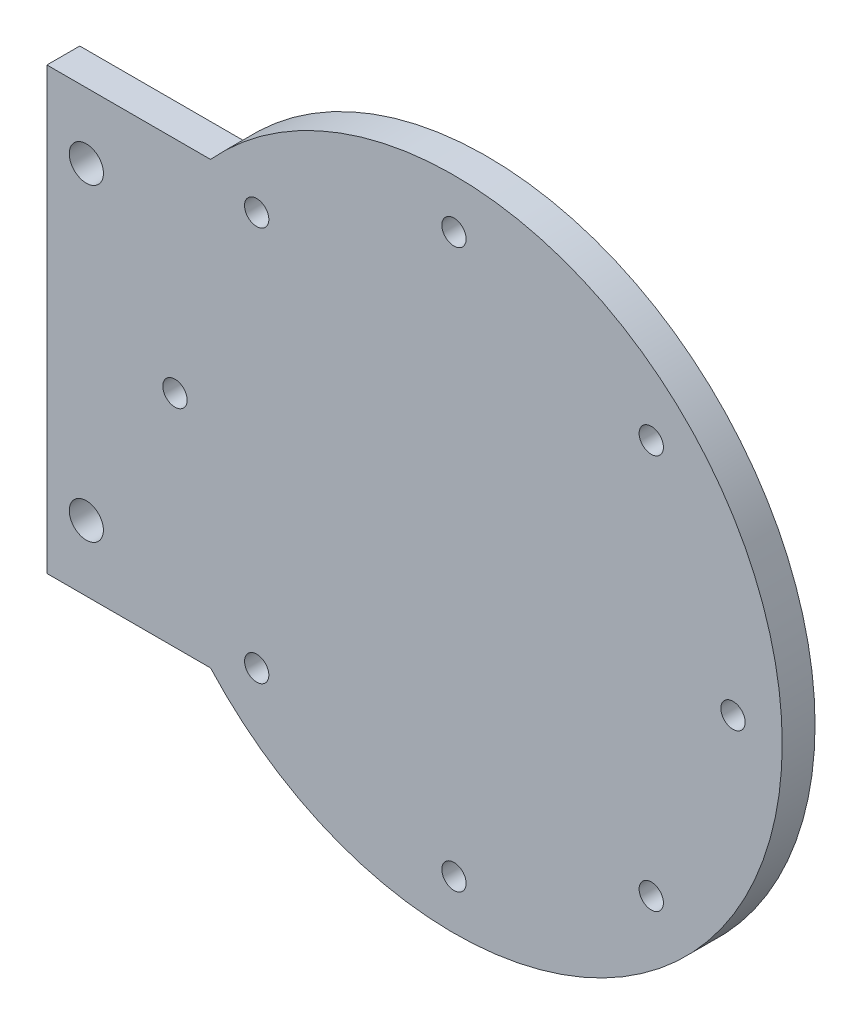
ISO-10303-21;
HEADER;
FILE_DESCRIPTION(('STEP AP214'),'2;1');
FILE_NAME('part.step','',(''),(''),'','','');
FILE_SCHEMA(('AUTOMOTIVE_DESIGN { 1 0 10303 214 1 1 1 1 }'));
ENDSEC;
DATA;
#1=APPLICATION_CONTEXT('core data for automotive mechanical design processes');
#2=APPLICATION_PROTOCOL_DEFINITION('international standard','automotive_design',2000,#1);
#3=PRODUCT_CONTEXT('',#1,'mechanical');
#4=PRODUCT('Part','Part','',(#3));
#5=PRODUCT_RELATED_PRODUCT_CATEGORY('part','',(#4));
#6=PRODUCT_DEFINITION_FORMATION('','',#4);
#7=PRODUCT_DEFINITION_CONTEXT('part definition',#1,'design');
#8=PRODUCT_DEFINITION('design','',#6,#7);
#9=PRODUCT_DEFINITION_SHAPE('','',#8);
#10=(LENGTH_UNIT() NAMED_UNIT(*) SI_UNIT(.MILLI.,.METRE.));
#11=(NAMED_UNIT(*) PLANE_ANGLE_UNIT() SI_UNIT($,.RADIAN.));
#12=(NAMED_UNIT(*) SI_UNIT($,.STERADIAN.) SOLID_ANGLE_UNIT());
#13=UNCERTAINTY_MEASURE_WITH_UNIT(LENGTH_MEASURE(1.E-05),#10,'distance_accuracy_value','');
#14=(GEOMETRIC_REPRESENTATION_CONTEXT(3) GLOBAL_UNCERTAINTY_ASSIGNED_CONTEXT((#13)) GLOBAL_UNIT_ASSIGNED_CONTEXT((#10,
#11,#12)) REPRESENTATION_CONTEXT('',''));
#15=CARTESIAN_POINT('',(0.,0.,0.));
#16=DIRECTION('',(0.,0.,1.));
#17=DIRECTION('',(1.,0.,0.));
#18=AXIS2_PLACEMENT_3D('',#15,#16,#17);
#19=CARTESIAN_POINT('',(0.,0.,5.));
#20=DIRECTION('',(0.,0.,1.));
#21=DIRECTION('',(1.,0.,0.));
#22=AXIS2_PLACEMENT_3D('',#19,#20,#21);
#23=PLANE('',#22);
#24=CARTESIAN_POINT('',(-36.3216750602466,-0.267487409630021,5.));
#25=DIRECTION('',(0.,0.,1.));
#26=DIRECTION('',(1.,0.,0.));
#27=AXIS2_PLACEMENT_3D('',#24,#25,#26);
#28=CIRCLE('',#27,1.85);
#29=CARTESIAN_POINT('',(-34.4716750602466,-0.267487409630021,5.));
#30=VERTEX_POINT('',#29);
#31=EDGE_CURVE('E143',#30,#30,#28,.T.);
#32=ORIENTED_EDGE('',*,*,#31,.F.);
#33=EDGE_LOOP('',(#32));
#34=FACE_BOUND('',#33,.T.);
#35=CARTESIAN_POINT('',(-23.8737132606749,-30.3195256100583,5.));
#36=DIRECTION('',(0.,0.,1.));
#37=DIRECTION('',(1.,0.,0.));
#38=AXIS2_PLACEMENT_3D('',#35,#36,#37);
#39=CIRCLE('',#38,1.85);
#40=CARTESIAN_POINT('',(-22.0237132606749,-30.3195256100583,5.));
#41=VERTEX_POINT('',#40);
#42=EDGE_CURVE('E148',#41,#41,#39,.T.);
#43=ORIENTED_EDGE('',*,*,#42,.F.);
#44=EDGE_LOOP('',(#43));
#45=FACE_BOUND('',#44,.T.);
#46=CARTESIAN_POINT('',(6.17832493975338,-42.76748740963,5.));
#47=DIRECTION('',(0.,0.,1.));
#48=DIRECTION('',(1.,0.,0.));
#49=AXIS2_PLACEMENT_3D('',#46,#47,#48);
#50=CIRCLE('',#49,1.85);
#51=CARTESIAN_POINT('',(8.02832493975338,-42.76748740963,5.));
#52=VERTEX_POINT('',#51);
#53=EDGE_CURVE('E151',#52,#52,#50,.T.);
#54=ORIENTED_EDGE('',*,*,#53,.F.);
#55=EDGE_LOOP('',(#54));
#56=FACE_BOUND('',#55,.T.);
#57=CARTESIAN_POINT('',(36.2303631401817,-30.3195256100583,5.));
#58=DIRECTION('',(0.,0.,1.));
#59=DIRECTION('',(1.,0.,0.));
#60=AXIS2_PLACEMENT_3D('',#57,#58,#59);
#61=CIRCLE('',#60,1.85);
#62=CARTESIAN_POINT('',(38.0803631401817,-30.3195256100583,5.));
#63=VERTEX_POINT('',#62);
#64=EDGE_CURVE('E154',#63,#63,#61,.T.);
#65=ORIENTED_EDGE('',*,*,#64,.F.);
#66=EDGE_LOOP('',(#65));
#67=FACE_BOUND('',#66,.T.);
#68=CARTESIAN_POINT('',(48.6783249397534,-0.267487409630026,5.));
#69=DIRECTION('',(0.,0.,1.));
#70=DIRECTION('',(1.,0.,0.));
#71=AXIS2_PLACEMENT_3D('',#68,#69,#70);
#72=CIRCLE('',#71,1.85);
#73=CARTESIAN_POINT('',(50.5283249397534,-0.267487409630026,5.));
#74=VERTEX_POINT('',#73);
#75=EDGE_CURVE('E157',#74,#74,#72,.T.);
#76=ORIENTED_EDGE('',*,*,#75,.F.);
#77=EDGE_LOOP('',(#76));
#78=FACE_BOUND('',#77,.T.);
#79=CARTESIAN_POINT('',(36.2303631401817,29.7845507907982,5.));
#80=DIRECTION('',(0.,0.,1.));
#81=DIRECTION('',(1.,0.,0.));
#82=AXIS2_PLACEMENT_3D('',#79,#80,#81);
#83=CIRCLE('',#82,1.85);
#84=CARTESIAN_POINT('',(38.0803631401817,29.7845507907982,5.));
#85=VERTEX_POINT('',#84);
#86=EDGE_CURVE('E160',#85,#85,#83,.T.);
#87=ORIENTED_EDGE('',*,*,#86,.F.);
#88=EDGE_LOOP('',(#87));
#89=FACE_BOUND('',#88,.T.);
#90=CARTESIAN_POINT('',(6.17832493975339,42.23251259037,5.));
#91=DIRECTION('',(0.,0.,1.));
#92=DIRECTION('',(1.,0.,0.));
#93=AXIS2_PLACEMENT_3D('',#90,#91,#92);
#94=CIRCLE('',#93,1.85);
#95=CARTESIAN_POINT('',(8.02832493975339,42.23251259037,5.));
#96=VERTEX_POINT('',#95);
#97=EDGE_CURVE('E163',#96,#96,#94,.T.);
#98=ORIENTED_EDGE('',*,*,#97,.F.);
#99=EDGE_LOOP('',(#98));
#100=FACE_BOUND('',#99,.T.);
#101=CARTESIAN_POINT('',(-23.8737132606749,29.7845507907983,5.));
#102=DIRECTION('',(0.,0.,1.));
#103=DIRECTION('',(1.,0.,0.));
#104=AXIS2_PLACEMENT_3D('',#101,#102,#103);
#105=CIRCLE('',#104,1.85);
#106=CARTESIAN_POINT('',(-22.0237132606749,29.7845507907983,5.));
#107=VERTEX_POINT('',#106);
#108=EDGE_CURVE('E166',#107,#107,#105,.T.);
#109=ORIENTED_EDGE('',*,*,#108,.F.);
#110=EDGE_LOOP('',(#109));
#111=FACE_BOUND('',#110,.T.);
#112=CARTESIAN_POINT('',(-49.8216750602466,-23.8085070721269,5.));
#113=DIRECTION('',(0.,0.,1.));
#114=DIRECTION('',(1.,0.,0.));
#115=AXIS2_PLACEMENT_3D('',#112,#113,#114);
#116=CIRCLE('',#115,2.6);
#117=CARTESIAN_POINT('',(-47.2216750602466,-23.8085070721269,5.));
#118=VERTEX_POINT('',#117);
#119=EDGE_CURVE('E118',#118,#118,#116,.T.);
#120=ORIENTED_EDGE('',*,*,#119,.F.);
#121=EDGE_LOOP('',(#120));
#122=FACE_BOUND('',#121,.T.);
#123=DIRECTION('',(-1.,0.,0.));
#124=VECTOR('',#123,1.);
#125=CARTESIAN_POINT('',(0.,-33.8085070721269,5.));
#126=LINE('',#125,#124);
#127=CARTESIAN_POINT('',(-30.9026674957249,-33.8085070721269,5.));
#128=VERTEX_POINT('',#127);
#129=CARTESIAN_POINT('',(-55.8216750602466,-33.8085070721269,5.));
#130=VERTEX_POINT('',#129);
#131=EDGE_CURVE('E106',#128,#130,#126,.T.);
#132=ORIENTED_EDGE('',*,*,#131,.F.);
#133=CARTESIAN_POINT('',(6.17832493975339,-0.267487409630021,5.));
#134=DIRECTION('',(0.,0.,1.));
#135=DIRECTION('',(1.,0.,0.));
#136=AXIS2_PLACEMENT_3D('',#133,#134,#135);
#137=CIRCLE('',#136,50.);
#138=CARTESIAN_POINT('',(-30.9026674957249,33.2735322528668,5.));
#139=VERTEX_POINT('',#138);
#140=EDGE_CURVE('E100',#128,#139,#137,.T.);
#141=ORIENTED_EDGE('',*,*,#140,.T.);
#142=DIRECTION('',(-1.,0.,0.));
#143=VECTOR('',#142,1.);
#144=CARTESIAN_POINT('',(0.,33.2735322528668,5.));
#145=LINE('',#144,#143);
#146=CARTESIAN_POINT('',(-55.8216750602466,33.2735322528668,5.));
#147=VERTEX_POINT('',#146);
#148=EDGE_CURVE('E105',#139,#147,#145,.T.);
#149=ORIENTED_EDGE('',*,*,#148,.T.);
#150=DIRECTION('',(0.,1.,0.));
#151=VECTOR('',#150,1.);
#152=CARTESIAN_POINT('',(-55.8216750602466,0.,5.));
#153=LINE('',#152,#151);
#154=EDGE_CURVE('E116',#130,#147,#153,.T.);
#155=ORIENTED_EDGE('',*,*,#154,.F.);
#156=EDGE_LOOP('',(#132,#141,#149,#155));
#157=FACE_BOUND('',#156,.T.);
#158=CARTESIAN_POINT('',(-49.8216750602466,23.2735322528668,5.));
#159=DIRECTION('',(0.,0.,1.));
#160=DIRECTION('',(1.,0.,0.));
#161=AXIS2_PLACEMENT_3D('',#158,#159,#160);
#162=CIRCLE('',#161,2.6);
#163=CARTESIAN_POINT('',(-47.2216750602466,23.2735322528668,5.));
#164=VERTEX_POINT('',#163);
#165=EDGE_CURVE('E126',#164,#164,#162,.T.);
#166=ORIENTED_EDGE('',*,*,#165,.F.);
#167=EDGE_LOOP('',(#166));
#168=FACE_BOUND('',#167,.T.);
#169=ADVANCED_FACE('F57',(#34,#45,#56,#67,#78,#89,#100,#111,#122,#157,#168),#23,.T.);
#170=CARTESIAN_POINT('',(0.,0.,0.));
#171=DIRECTION('',(0.,0.,1.));
#172=DIRECTION('',(1.,0.,0.));
#173=AXIS2_PLACEMENT_3D('',#170,#171,#172);
#174=PLANE('',#173);
#175=CARTESIAN_POINT('',(-36.3216750602466,-0.267487409630021,0.));
#176=DIRECTION('',(0.,0.,-1.));
#177=DIRECTION('',(-1.,0.,0.));
#178=AXIS2_PLACEMENT_3D('',#175,#176,#177);
#179=CIRCLE('',#178,1.85);
#180=CARTESIAN_POINT('',(-38.1716750602466,-0.267487409630021,0.));
#181=VERTEX_POINT('',#180);
#182=EDGE_CURVE('E172',#181,#181,#179,.T.);
#183=ORIENTED_EDGE('',*,*,#182,.F.);
#184=EDGE_LOOP('',(#183));
#185=FACE_BOUND('',#184,.T.);
#186=CARTESIAN_POINT('',(-23.8737132606749,-30.3195256100583,0.));
#187=DIRECTION('',(0.,0.,-1.));
#188=DIRECTION('',(-1.,0.,0.));
#189=AXIS2_PLACEMENT_3D('',#186,#187,#188);
#190=CIRCLE('',#189,1.85);
#191=CARTESIAN_POINT('',(-25.7237132606749,-30.3195256100583,0.));
#192=VERTEX_POINT('',#191);
#193=EDGE_CURVE('E180',#192,#192,#190,.T.);
#194=ORIENTED_EDGE('',*,*,#193,.F.);
#195=EDGE_LOOP('',(#194));
#196=FACE_BOUND('',#195,.T.);
#197=CARTESIAN_POINT('',(6.17832493975338,-42.76748740963,0.));
#198=DIRECTION('',(0.,0.,-1.));
#199=DIRECTION('',(-1.,0.,0.));
#200=AXIS2_PLACEMENT_3D('',#197,#198,#199);
#201=CIRCLE('',#200,1.85);
#202=CARTESIAN_POINT('',(4.32832493975338,-42.76748740963,0.));
#203=VERTEX_POINT('',#202);
#204=EDGE_CURVE('E176',#203,#203,#201,.T.);
#205=ORIENTED_EDGE('',*,*,#204,.F.);
#206=EDGE_LOOP('',(#205));
#207=FACE_BOUND('',#206,.T.);
#208=CARTESIAN_POINT('',(36.2303631401817,-30.3195256100583,0.));
#209=DIRECTION('',(0.,0.,-1.));
#210=DIRECTION('',(-1.,0.,0.));
#211=AXIS2_PLACEMENT_3D('',#208,#209,#210);
#212=CIRCLE('',#211,1.85);
#213=CARTESIAN_POINT('',(34.3803631401817,-30.3195256100583,0.));
#214=VERTEX_POINT('',#213);
#215=EDGE_CURVE('E173',#214,#214,#212,.T.);
#216=ORIENTED_EDGE('',*,*,#215,.F.);
#217=EDGE_LOOP('',(#216));
#218=FACE_BOUND('',#217,.T.);
#219=CARTESIAN_POINT('',(48.6783249397534,-0.267487409630026,0.));
#220=DIRECTION('',(0.,0.,-1.));
#221=DIRECTION('',(-1.,0.,0.));
#222=AXIS2_PLACEMENT_3D('',#219,#220,#221);
#223=CIRCLE('',#222,1.85);
#224=CARTESIAN_POINT('',(46.8283249397534,-0.267487409630026,0.));
#225=VERTEX_POINT('',#224);
#226=EDGE_CURVE('E177',#225,#225,#223,.T.);
#227=ORIENTED_EDGE('',*,*,#226,.F.);
#228=EDGE_LOOP('',(#227));
#229=FACE_BOUND('',#228,.T.);
#230=CARTESIAN_POINT('',(36.2303631401817,29.7845507907982,0.));
#231=DIRECTION('',(0.,0.,-1.));
#232=DIRECTION('',(-1.,0.,0.));
#233=AXIS2_PLACEMENT_3D('',#230,#231,#232);
#234=CIRCLE('',#233,1.85);
#235=CARTESIAN_POINT('',(34.3803631401817,29.7845507907982,0.));
#236=VERTEX_POINT('',#235);
#237=EDGE_CURVE('E188',#236,#236,#234,.T.);
#238=ORIENTED_EDGE('',*,*,#237,.F.);
#239=EDGE_LOOP('',(#238));
#240=FACE_BOUND('',#239,.T.);
#241=CARTESIAN_POINT('',(6.17832493975339,42.23251259037,0.));
#242=DIRECTION('',(0.,0.,-1.));
#243=DIRECTION('',(-1.,0.,0.));
#244=AXIS2_PLACEMENT_3D('',#241,#242,#243);
#245=CIRCLE('',#244,1.85);
#246=CARTESIAN_POINT('',(4.32832493975339,42.23251259037,0.));
#247=VERTEX_POINT('',#246);
#248=EDGE_CURVE('E185',#247,#247,#245,.T.);
#249=ORIENTED_EDGE('',*,*,#248,.F.);
#250=EDGE_LOOP('',(#249));
#251=FACE_BOUND('',#250,.T.);
#252=CARTESIAN_POINT('',(-23.8737132606749,29.7845507907983,0.));
#253=DIRECTION('',(0.,0.,-1.));
#254=DIRECTION('',(-1.,0.,0.));
#255=AXIS2_PLACEMENT_3D('',#252,#253,#254);
#256=CIRCLE('',#255,1.85);
#257=CARTESIAN_POINT('',(-25.7237132606749,29.7845507907983,0.));
#258=VERTEX_POINT('',#257);
#259=EDGE_CURVE('E169',#258,#258,#256,.T.);
#260=ORIENTED_EDGE('',*,*,#259,.F.);
#261=EDGE_LOOP('',(#260));
#262=FACE_BOUND('',#261,.T.);
#263=DIRECTION('',(-1.,0.,0.));
#264=VECTOR('',#263,1.);
#265=CARTESIAN_POINT('',(0.,-33.8085070721269,0.));
#266=LINE('',#265,#264);
#267=CARTESIAN_POINT('',(-30.9026674957249,-33.8085070721269,0.));
#268=VERTEX_POINT('',#267);
#269=CARTESIAN_POINT('',(-55.8216750602466,-33.8085070721269,0.));
#270=VERTEX_POINT('',#269);
#271=EDGE_CURVE('E124',#268,#270,#266,.T.);
#272=ORIENTED_EDGE('',*,*,#271,.T.);
#273=DIRECTION('',(0.,1.,0.));
#274=VECTOR('',#273,1.);
#275=CARTESIAN_POINT('',(-55.8216750602466,0.,0.));
#276=LINE('',#275,#274);
#277=CARTESIAN_POINT('',(-55.8216750602466,33.2735322528668,0.));
#278=VERTEX_POINT('',#277);
#279=EDGE_CURVE('E130',#270,#278,#276,.T.);
#280=ORIENTED_EDGE('',*,*,#279,.T.);
#281=DIRECTION('',(-1.,0.,0.));
#282=VECTOR('',#281,1.);
#283=CARTESIAN_POINT('',(0.,33.2735322528668,0.));
#284=LINE('',#283,#282);
#285=CARTESIAN_POINT('',(-30.9026674957249,33.2735322528668,0.));
#286=VERTEX_POINT('',#285);
#287=EDGE_CURVE('E128',#286,#278,#284,.T.);
#288=ORIENTED_EDGE('',*,*,#287,.F.);
#289=CARTESIAN_POINT('',(6.17832493975339,-0.267487409630021,0.));
#290=DIRECTION('',(0.,0.,1.));
#291=DIRECTION('',(1.,0.,0.));
#292=AXIS2_PLACEMENT_3D('',#289,#290,#291);
#293=CIRCLE('',#292,50.);
#294=EDGE_CURVE('E112',#268,#286,#293,.T.);
#295=ORIENTED_EDGE('',*,*,#294,.F.);
#296=EDGE_LOOP('',(#272,#280,#288,#295));
#297=FACE_BOUND('',#296,.T.);
#298=CARTESIAN_POINT('',(-49.8216750602466,-23.8085070721269,0.));
#299=DIRECTION('',(0.,0.,1.));
#300=DIRECTION('',(1.,0.,0.));
#301=AXIS2_PLACEMENT_3D('',#298,#299,#300);
#302=CIRCLE('',#301,2.6);
#303=CARTESIAN_POINT('',(-47.2216750602466,-23.8085070721269,0.));
#304=VERTEX_POINT('',#303);
#305=EDGE_CURVE('E133',#304,#304,#302,.T.);
#306=ORIENTED_EDGE('',*,*,#305,.T.);
#307=EDGE_LOOP('',(#306));
#308=FACE_BOUND('',#307,.T.);
#309=CARTESIAN_POINT('',(-49.8216750602466,23.2735322528668,0.));
#310=DIRECTION('',(0.,0.,1.));
#311=DIRECTION('',(1.,0.,0.));
#312=AXIS2_PLACEMENT_3D('',#309,#310,#311);
#313=CIRCLE('',#312,2.6);
#314=CARTESIAN_POINT('',(-47.2216750602466,23.2735322528668,0.));
#315=VERTEX_POINT('',#314);
#316=EDGE_CURVE('E140',#315,#315,#313,.T.);
#317=ORIENTED_EDGE('',*,*,#316,.T.);
#318=EDGE_LOOP('',(#317));
#319=FACE_BOUND('',#318,.T.);
#320=ADVANCED_FACE('F196',(#185,#196,#207,#218,#229,#240,#251,#262,#297,#308,#319),#174,.F.);
#321=CARTESIAN_POINT('',(0.,-33.8085070721269,5.));
#322=DIRECTION('',(0.,-1.,0.));
#323=DIRECTION('',(0.,0.,-1.));
#324=AXIS2_PLACEMENT_3D('',#321,#322,#323);
#325=PLANE('',#324);
#326=ORIENTED_EDGE('',*,*,#271,.F.);
#327=DIRECTION('',(0.,0.,-1.));
#328=VECTOR('',#327,1.);
#329=CARTESIAN_POINT('',(-30.9026674957249,-33.8085070721269,5.));
#330=LINE('',#329,#328);
#331=EDGE_CURVE('E12',#128,#268,#330,.T.);
#332=ORIENTED_EDGE('',*,*,#331,.F.);
#333=ORIENTED_EDGE('',*,*,#131,.T.);
#334=DIRECTION('',(0.,0.,-1.));
#335=VECTOR('',#334,1.);
#336=CARTESIAN_POINT('',(-55.8216750602466,-33.8085070721269,5.));
#337=LINE('',#336,#335);
#338=EDGE_CURVE('E74',#130,#270,#337,.T.);
#339=ORIENTED_EDGE('',*,*,#338,.T.);
#340=EDGE_LOOP('',(#326,#332,#333,#339));
#341=FACE_BOUND('',#340,.T.);
#342=ADVANCED_FACE('F59',(#341),#325,.T.);
#343=CARTESIAN_POINT('',(6.17832493975339,-0.267487409630021,5.));
#344=DIRECTION('',(0.,0.,-1.));
#345=DIRECTION('',(-1.,0.,0.));
#346=AXIS2_PLACEMENT_3D('',#343,#344,#345);
#347=CYLINDRICAL_SURFACE('',#346,50.);
#348=ORIENTED_EDGE('',*,*,#294,.T.);
#349=DIRECTION('',(0.,0.,-1.));
#350=VECTOR('',#349,1.);
#351=CARTESIAN_POINT('',(-30.9026674957249,33.2735322528668,5.));
#352=LINE('',#351,#350);
#353=EDGE_CURVE('E66',#139,#286,#352,.T.);
#354=ORIENTED_EDGE('',*,*,#353,.F.);
#355=ORIENTED_EDGE('',*,*,#140,.F.);
#356=ORIENTED_EDGE('',*,*,#331,.T.);
#357=EDGE_LOOP('',(#348,#354,#355,#356));
#358=FACE_BOUND('',#357,.T.);
#359=ADVANCED_FACE('F110',(#358),#347,.T.);
#360=CARTESIAN_POINT('',(0.,33.2735322528668,5.));
#361=DIRECTION('',(0.,-1.,0.));
#362=DIRECTION('',(0.,0.,-1.));
#363=AXIS2_PLACEMENT_3D('',#360,#361,#362);
#364=PLANE('',#363);
#365=ORIENTED_EDGE('',*,*,#287,.T.);
#366=DIRECTION('',(0.,0.,-1.));
#367=VECTOR('',#366,1.);
#368=CARTESIAN_POINT('',(-55.8216750602466,33.2735322528668,5.));
#369=LINE('',#368,#367);
#370=EDGE_CURVE('E88',#147,#278,#369,.T.);
#371=ORIENTED_EDGE('',*,*,#370,.F.);
#372=ORIENTED_EDGE('',*,*,#148,.F.);
#373=ORIENTED_EDGE('',*,*,#353,.T.);
#374=EDGE_LOOP('',(#365,#371,#372,#373));
#375=FACE_BOUND('',#374,.T.);
#376=ADVANCED_FACE('F115',(#375),#364,.F.);
#377=CARTESIAN_POINT('',(-55.8216750602466,0.,5.));
#378=DIRECTION('',(-1.,0.,0.));
#379=DIRECTION('',(0.,0.,1.));
#380=AXIS2_PLACEMENT_3D('',#377,#378,#379);
#381=PLANE('',#380);
#382=ORIENTED_EDGE('',*,*,#279,.F.);
#383=ORIENTED_EDGE('',*,*,#338,.F.);
#384=ORIENTED_EDGE('',*,*,#154,.T.);
#385=ORIENTED_EDGE('',*,*,#370,.T.);
#386=EDGE_LOOP('',(#382,#383,#384,#385));
#387=FACE_BOUND('',#386,.T.);
#388=ADVANCED_FACE('F223',(#387),#381,.T.);
#389=CARTESIAN_POINT('',(-49.8216750602466,-23.8085070721269,5.));
#390=DIRECTION('',(0.,0.,-1.));
#391=DIRECTION('',(-1.,0.,0.));
#392=AXIS2_PLACEMENT_3D('',#389,#390,#391);
#393=CYLINDRICAL_SURFACE('',#392,2.6);
#394=ORIENTED_EDGE('',*,*,#119,.T.);
#395=EDGE_LOOP('',(#394));
#396=FACE_BOUND('',#395,.T.);
#397=ORIENTED_EDGE('',*,*,#305,.F.);
#398=EDGE_LOOP('',(#397));
#399=FACE_BOUND('',#398,.T.);
#400=ADVANCED_FACE('F213',(#396,#399),#393,.F.);
#401=CARTESIAN_POINT('',(-49.8216750602466,23.2735322528668,5.));
#402=DIRECTION('',(0.,0.,-1.));
#403=DIRECTION('',(-1.,0.,0.));
#404=AXIS2_PLACEMENT_3D('',#401,#402,#403);
#405=CYLINDRICAL_SURFACE('',#404,2.6);
#406=ORIENTED_EDGE('',*,*,#165,.T.);
#407=EDGE_LOOP('',(#406));
#408=FACE_BOUND('',#407,.T.);
#409=ORIENTED_EDGE('',*,*,#316,.F.);
#410=EDGE_LOOP('',(#409));
#411=FACE_BOUND('',#410,.T.);
#412=ADVANCED_FACE('F210',(#408,#411),#405,.F.);
#413=CARTESIAN_POINT('',(-23.8737132606749,29.7845507907983,10.));
#414=DIRECTION('',(0.,0.,-1.));
#415=DIRECTION('',(-1.,0.,0.));
#416=AXIS2_PLACEMENT_3D('',#413,#414,#415);
#417=CYLINDRICAL_SURFACE('',#416,1.85);
#418=ORIENTED_EDGE('',*,*,#108,.T.);
#419=EDGE_LOOP('',(#418));
#420=FACE_BOUND('',#419,.T.);
#421=ORIENTED_EDGE('',*,*,#259,.T.);
#422=EDGE_LOOP('',(#421));
#423=FACE_BOUND('',#422,.T.);
#424=ADVANCED_FACE('F212',(#420,#423),#417,.F.);
#425=CARTESIAN_POINT('',(6.17832493975339,42.23251259037,10.));
#426=DIRECTION('',(0.,0.,-1.));
#427=DIRECTION('',(-1.,0.,0.));
#428=AXIS2_PLACEMENT_3D('',#425,#426,#427);
#429=CYLINDRICAL_SURFACE('',#428,1.85);
#430=ORIENTED_EDGE('',*,*,#97,.T.);
#431=EDGE_LOOP('',(#430));
#432=FACE_BOUND('',#431,.T.);
#433=ORIENTED_EDGE('',*,*,#248,.T.);
#434=EDGE_LOOP('',(#433));
#435=FACE_BOUND('',#434,.T.);
#436=ADVANCED_FACE('F220',(#432,#435),#429,.F.);
#437=CARTESIAN_POINT('',(36.2303631401817,29.7845507907982,10.));
#438=DIRECTION('',(0.,0.,-1.));
#439=DIRECTION('',(-1.,0.,0.));
#440=AXIS2_PLACEMENT_3D('',#437,#438,#439);
#441=CYLINDRICAL_SURFACE('',#440,1.85);
#442=ORIENTED_EDGE('',*,*,#86,.T.);
#443=EDGE_LOOP('',(#442));
#444=FACE_BOUND('',#443,.T.);
#445=ORIENTED_EDGE('',*,*,#237,.T.);
#446=EDGE_LOOP('',(#445));
#447=FACE_BOUND('',#446,.T.);
#448=ADVANCED_FACE('F268',(#444,#447),#441,.F.);
#449=CARTESIAN_POINT('',(48.6783249397534,-0.267487409630026,10.));
#450=DIRECTION('',(0.,0.,-1.));
#451=DIRECTION('',(-1.,0.,0.));
#452=AXIS2_PLACEMENT_3D('',#449,#450,#451);
#453=CYLINDRICAL_SURFACE('',#452,1.85);
#454=ORIENTED_EDGE('',*,*,#75,.T.);
#455=EDGE_LOOP('',(#454));
#456=FACE_BOUND('',#455,.T.);
#457=ORIENTED_EDGE('',*,*,#226,.T.);
#458=EDGE_LOOP('',(#457));
#459=FACE_BOUND('',#458,.T.);
#460=ADVANCED_FACE('F194',(#456,#459),#453,.F.);
#461=CARTESIAN_POINT('',(36.2303631401817,-30.3195256100583,10.));
#462=DIRECTION('',(0.,0.,-1.));
#463=DIRECTION('',(-1.,0.,0.));
#464=AXIS2_PLACEMENT_3D('',#461,#462,#463);
#465=CYLINDRICAL_SURFACE('',#464,1.85);
#466=ORIENTED_EDGE('',*,*,#64,.T.);
#467=EDGE_LOOP('',(#466));
#468=FACE_BOUND('',#467,.T.);
#469=ORIENTED_EDGE('',*,*,#215,.T.);
#470=EDGE_LOOP('',(#469));
#471=FACE_BOUND('',#470,.T.);
#472=ADVANCED_FACE('F289',(#468,#471),#465,.F.);
#473=CARTESIAN_POINT('',(6.17832493975338,-42.76748740963,10.));
#474=DIRECTION('',(0.,0.,-1.));
#475=DIRECTION('',(-1.,0.,0.));
#476=AXIS2_PLACEMENT_3D('',#473,#474,#475);
#477=CYLINDRICAL_SURFACE('',#476,1.85);
#478=ORIENTED_EDGE('',*,*,#53,.T.);
#479=EDGE_LOOP('',(#478));
#480=FACE_BOUND('',#479,.T.);
#481=ORIENTED_EDGE('',*,*,#204,.T.);
#482=EDGE_LOOP('',(#481));
#483=FACE_BOUND('',#482,.T.);
#484=ADVANCED_FACE('F300',(#480,#483),#477,.F.);
#485=CARTESIAN_POINT('',(-23.8737132606749,-30.3195256100583,10.));
#486=DIRECTION('',(0.,0.,-1.));
#487=DIRECTION('',(-1.,0.,0.));
#488=AXIS2_PLACEMENT_3D('',#485,#486,#487);
#489=CYLINDRICAL_SURFACE('',#488,1.85);
#490=ORIENTED_EDGE('',*,*,#42,.T.);
#491=EDGE_LOOP('',(#490));
#492=FACE_BOUND('',#491,.T.);
#493=ORIENTED_EDGE('',*,*,#193,.T.);
#494=EDGE_LOOP('',(#493));
#495=FACE_BOUND('',#494,.T.);
#496=ADVANCED_FACE('F311',(#492,#495),#489,.F.);
#497=CARTESIAN_POINT('',(-36.3216750602466,-0.267487409630021,10.));
#498=DIRECTION('',(0.,0.,-1.));
#499=DIRECTION('',(-1.,0.,0.));
#500=AXIS2_PLACEMENT_3D('',#497,#498,#499);
#501=CYLINDRICAL_SURFACE('',#500,1.85);
#502=ORIENTED_EDGE('',*,*,#31,.T.);
#503=EDGE_LOOP('',(#502));
#504=FACE_BOUND('',#503,.T.);
#505=ORIENTED_EDGE('',*,*,#182,.T.);
#506=EDGE_LOOP('',(#505));
#507=FACE_BOUND('',#506,.T.);
#508=ADVANCED_FACE('F322',(#504,#507),#501,.F.);
#509=CLOSED_SHELL('',(#169,#320,#342,#359,#376,#388,#400,#412,#424,#436,#448,#460,#472,#484,
#496,#508));
#510=MANIFOLD_SOLID_BREP('B2',#509);
#511=ADVANCED_BREP_SHAPE_REPRESENTATION('',(#18,#510),#14);
#512=SHAPE_DEFINITION_REPRESENTATION(#9,#511);
ENDSEC;
END-ISO-10303-21;
